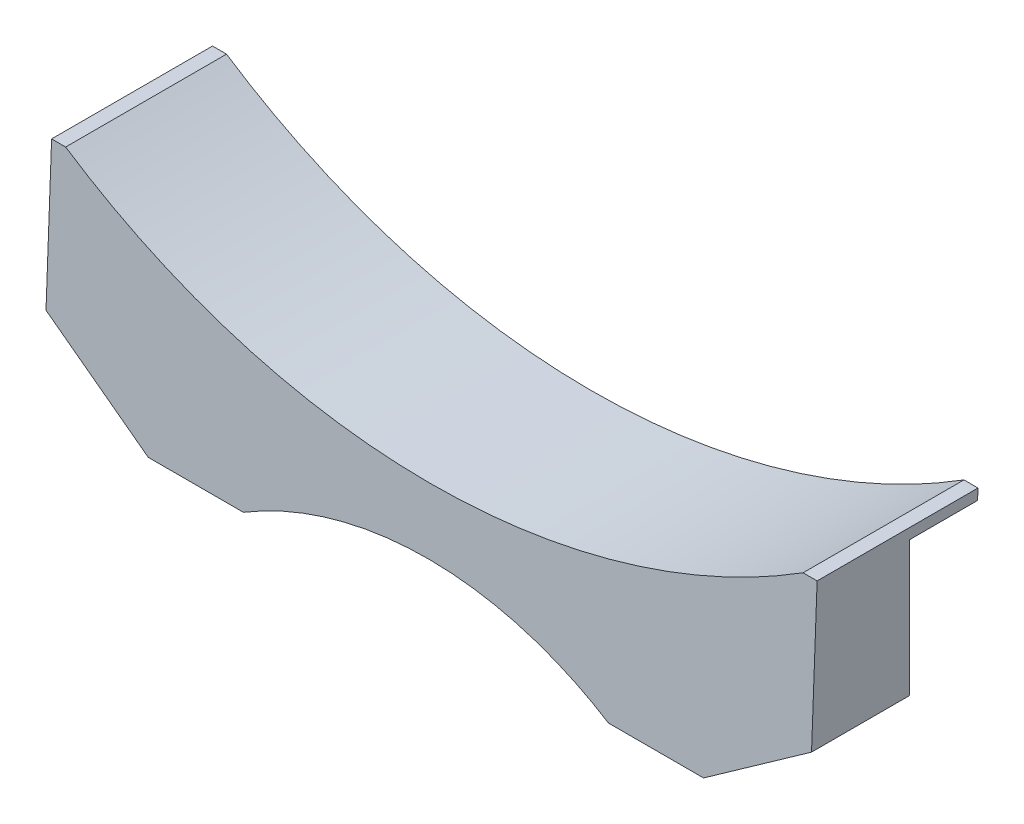
ISO-10303-21;
HEADER;
FILE_DESCRIPTION(('STEP AP214'),'2;1');
FILE_NAME('part.step','',(''),(''),'','','');
FILE_SCHEMA(('AUTOMOTIVE_DESIGN { 1 0 10303 214 1 1 1 1 }'));
ENDSEC;
DATA;
#1=APPLICATION_CONTEXT('core data for automotive mechanical design processes');
#2=APPLICATION_PROTOCOL_DEFINITION('international standard','automotive_design',2000,#1);
#3=PRODUCT_CONTEXT('',#1,'mechanical');
#4=PRODUCT('Part','Part','',(#3));
#5=PRODUCT_RELATED_PRODUCT_CATEGORY('part','',(#4));
#6=PRODUCT_DEFINITION_FORMATION('','',#4);
#7=PRODUCT_DEFINITION_CONTEXT('part definition',#1,'design');
#8=PRODUCT_DEFINITION('design','',#6,#7);
#9=PRODUCT_DEFINITION_SHAPE('','',#8);
#10=(LENGTH_UNIT() NAMED_UNIT(*) SI_UNIT(.MILLI.,.METRE.));
#11=(NAMED_UNIT(*) PLANE_ANGLE_UNIT() SI_UNIT($,.RADIAN.));
#12=(NAMED_UNIT(*) SI_UNIT($,.STERADIAN.) SOLID_ANGLE_UNIT());
#13=UNCERTAINTY_MEASURE_WITH_UNIT(LENGTH_MEASURE(1.E-05),#10,'distance_accuracy_value','');
#14=(GEOMETRIC_REPRESENTATION_CONTEXT(3) GLOBAL_UNCERTAINTY_ASSIGNED_CONTEXT((#13)) GLOBAL_UNIT_ASSIGNED_CONTEXT((#10,
#11,#12)) REPRESENTATION_CONTEXT('',''));
#15=CARTESIAN_POINT('',(0.,0.,0.));
#16=DIRECTION('',(0.,0.,1.));
#17=DIRECTION('',(1.,0.,0.));
#18=AXIS2_PLACEMENT_3D('',#15,#16,#17);
#19=CARTESIAN_POINT('',(12.3672169018671,-10.9582396338025,6.58));
#20=DIRECTION('',(0.,0.,-1.));
#21=DIRECTION('',(0.,1.,0.));
#22=AXIS2_PLACEMENT_3D('',#19,#20,#21);
#23=PLANE('',#22);
#24=DIRECTION('',(-0.819550109352107,-0.573007520248164,0.));
#25=VECTOR('',#24,1.);
#26=CARTESIAN_POINT('',(6.074318290855,-17.7929098966027,6.58));
#27=LINE('',#26,#25);
#28=CARTESIAN_POINT('',(8.37499999999795,-16.1843347698438,6.58));
#29=VERTEX_POINT('',#28);
#30=CARTESIAN_POINT('',(6.074318290855,-17.7929098966027,6.58));
#31=VERTEX_POINT('',#30);
#32=EDGE_CURVE('E85',#29,#31,#27,.T.);
#33=ORIENTED_EDGE('',*,*,#32,.T.);
#34=DIRECTION('',(1.,0.,0.));
#35=VECTOR('',#34,1.);
#36=CARTESIAN_POINT('',(3.993745109543,-17.7929098966027,6.58));
#37=LINE('',#36,#35);
#38=CARTESIAN_POINT('',(3.9935960408029,-17.7929098966027,6.58));
#39=VERTEX_POINT('',#38);
#40=EDGE_CURVE('E163',#31,#39,#37,.F.);
#41=ORIENTED_EDGE('',*,*,#40,.T.);
#42=CARTESIAN_POINT('',(0.,-24.5028211392062,6.58));
#43=DIRECTION('',(0.,0.,1.));
#44=DIRECTION('',(0.,-1.,0.));
#45=AXIS2_PLACEMENT_3D('',#42,#43,#44);
#46=CIRCLE('',#45,7.80843891061033);
#47=CARTESIAN_POINT('',(1.88722564128328,-16.9258760028325,6.58));
#48=VERTEX_POINT('',#47);
#49=EDGE_CURVE('E106',#39,#48,#46,.T.);
#50=ORIENTED_EDGE('',*,*,#49,.T.);
#51=DIRECTION('',(-0.868989755925164,-0.494830075982779,0.));
#52=VECTOR('',#51,1.);
#53=CARTESIAN_POINT('',(-1.90913270574887,-19.0876417503698,6.58));
#54=LINE('',#53,#52);
#55=CARTESIAN_POINT('',(8.37499999999985,-13.2315333975334,6.58));
#56=VERTEX_POINT('',#55);
#57=EDGE_CURVE('E102',#48,#56,#54,.F.);
#58=ORIENTED_EDGE('',*,*,#57,.T.);
#59=DIRECTION('',(-6.46237264413794E-13,-1.,0.));
#60=VECTOR('',#59,1.);
#61=CARTESIAN_POINT('',(8.37499999999794,-16.1843347698438,6.58));
#62=LINE('',#61,#60);
#63=EDGE_CURVE('E104',#56,#29,#62,.T.);
#64=ORIENTED_EDGE('',*,*,#63,.T.);
#65=EDGE_LOOP('',(#33,#41,#50,#58,#64));
#66=FACE_BOUND('',#65,.T.);
#67=ADVANCED_FACE('F16',(#66),#23,.T.);
#68=CARTESIAN_POINT('',(-12.1258749192069,-11.0956673431733,6.58));
#69=DIRECTION('',(0.,0.,1.));
#70=DIRECTION('',(0.,-1.,0.));
#71=AXIS2_PLACEMENT_3D('',#68,#69,#70);
#72=PLANE('',#71);
#73=CARTESIAN_POINT('',(0.,-24.5028211392062,6.58));
#74=DIRECTION('',(0.,0.,1.));
#75=DIRECTION('',(0.,-1.,0.));
#76=AXIS2_PLACEMENT_3D('',#73,#74,#75);
#77=CIRCLE('',#76,7.80843891061033);
#78=CARTESIAN_POINT('',(-1.88722564128269,-16.9258760028324,6.58));
#79=VERTEX_POINT('',#78);
#80=CARTESIAN_POINT('',(-3.9935960408029,-17.7929098966027,6.58));
#81=VERTEX_POINT('',#80);
#82=EDGE_CURVE('E19',#79,#81,#77,.T.);
#83=ORIENTED_EDGE('',*,*,#82,.T.);
#84=DIRECTION('',(1.,0.,0.));
#85=VECTOR('',#84,1.);
#86=CARTESIAN_POINT('',(-12.1258749192069,-17.7929098966027,6.58));
#87=LINE('',#86,#85);
#88=CARTESIAN_POINT('',(-6.07568170914495,-17.7929098966027,6.58));
#89=VERTEX_POINT('',#88);
#90=EDGE_CURVE('E190',#81,#89,#87,.F.);
#91=ORIENTED_EDGE('',*,*,#90,.T.);
#92=DIRECTION('',(-0.819550109352106,0.573007520248165,0.));
#93=VECTOR('',#92,1.);
#94=CARTESIAN_POINT('',(-8.375,-16.1852880354505,6.58));
#95=LINE('',#94,#93);
#96=CARTESIAN_POINT('',(-8.375,-16.1852880354505,6.58));
#97=VERTEX_POINT('',#96);
#98=EDGE_CURVE('E155',#89,#97,#95,.T.);
#99=ORIENTED_EDGE('',*,*,#98,.T.);
#100=DIRECTION('',(0.,1.,0.));
#101=VECTOR('',#100,1.);
#102=CARTESIAN_POINT('',(-8.375,-13.,6.58));
#103=LINE('',#102,#101);
#104=CARTESIAN_POINT('',(-8.375,-13.2315333975374,6.58));
#105=VERTEX_POINT('',#104);
#106=EDGE_CURVE('E143',#97,#105,#103,.T.);
#107=ORIENTED_EDGE('',*,*,#106,.T.);
#108=DIRECTION('',(0.868989755925428,-0.494830075982317,0.));
#109=VECTOR('',#108,1.);
#110=CARTESIAN_POINT('',(2.65904385816105,-19.5146647273325,6.58));
#111=LINE('',#110,#109);
#112=EDGE_CURVE('E111',#79,#105,#111,.F.);
#113=ORIENTED_EDGE('',*,*,#112,.F.);
#114=EDGE_LOOP('',(#83,#91,#99,#107,#113));
#115=FACE_BOUND('',#114,.T.);
#116=ADVANCED_FACE('F203',(#115),#72,.F.);
#117=CARTESIAN_POINT('',(2.65904385816105,-19.5146647273325,6.58));
#118=DIRECTION('',(-0.494830075982317,-0.868989755925428,0.));
#119=DIRECTION('',(0.868989755925428,-0.494830075982317,0.));
#120=AXIS2_PLACEMENT_3D('',#117,#118,#119);
#121=PLANE('',#120);
#122=DIRECTION('',(0.,0.,1.));
#123=VECTOR('',#122,1.);
#124=CARTESIAN_POINT('',(-1.8872256412827,-16.9258760028324,8.78434268833087));
#125=LINE('',#124,#123);
#126=CARTESIAN_POINT('',(-1.8872256412827,-16.9258760028324,5.23099523087817));
#127=VERTEX_POINT('',#126);
#128=EDGE_CURVE('E194',#127,#79,#125,.T.);
#129=ORIENTED_EDGE('',*,*,#128,.T.);
#130=ORIENTED_EDGE('',*,*,#112,.T.);
#131=DIRECTION('',(0.,0.,1.));
#132=VECTOR('',#131,1.);
#133=CARTESIAN_POINT('',(-8.375,-13.2315333975374,8.6));
#134=LINE('',#133,#132);
#135=CARTESIAN_POINT('',(-8.375,-13.2315333975374,5.08890513067451));
#136=VERTEX_POINT('',#135);
#137=EDGE_CURVE('E139',#105,#136,#134,.F.);
#138=ORIENTED_EDGE('',*,*,#137,.T.);
#139=DIRECTION('',(-0.868832418448767,0.494740483078604,-0.0190284801184085));
#140=VECTOR('',#139,1.);
#141=CARTESIAN_POINT('',(-1.8872256412827,-16.9258760028324,5.23099523087817));
#142=LINE('',#141,#140);
#143=EDGE_CURVE('E136',#127,#136,#142,.T.);
#144=ORIENTED_EDGE('',*,*,#143,.F.);
#145=EDGE_LOOP('',(#129,#130,#138,#144));
#146=FACE_BOUND('',#145,.T.);
#147=ADVANCED_FACE('F326',(#146),#121,.T.);
#148=CARTESIAN_POINT('',(-1.90913270574887,-19.0876417503698,6.58));
#149=DIRECTION('',(-0.494830075982779,0.868989755925164,0.));
#150=DIRECTION('',(-0.868989755925164,-0.494830075982779,0.));
#151=AXIS2_PLACEMENT_3D('',#148,#149,#150);
#152=PLANE('',#151);
#153=DIRECTION('',(0.,0.,1.));
#154=VECTOR('',#153,1.);
#155=CARTESIAN_POINT('',(8.37499999999985,-13.2315333975334,8.72247441422476));
#156=LINE('',#155,#154);
#157=CARTESIAN_POINT('',(8.37499999999995,-13.2315333975333,5.08890513067436));
#158=VERTEX_POINT('',#157);
#159=EDGE_CURVE('E110',#158,#56,#156,.T.);
#160=ORIENTED_EDGE('',*,*,#159,.T.);
#161=ORIENTED_EDGE('',*,*,#57,.F.);
#162=DIRECTION('',(0.,0.,1.));
#163=VECTOR('',#162,1.);
#164=CARTESIAN_POINT('',(1.88722564128328,-16.9258760028325,6.58));
#165=LINE('',#164,#163);
#166=CARTESIAN_POINT('',(1.88722564128334,-16.9258760028326,5.23099523087818));
#167=VERTEX_POINT('',#166);
#168=EDGE_CURVE('E195',#48,#167,#165,.F.);
#169=ORIENTED_EDGE('',*,*,#168,.T.);
#170=DIRECTION('',(-0.868832418448499,-0.494740483079074,0.0190284801184265));
#171=VECTOR('',#170,1.);
#172=CARTESIAN_POINT('',(8.37499999999985,-13.2315333975334,5.08890513067436));
#173=LINE('',#172,#171);
#174=EDGE_CURVE('E124',#158,#167,#173,.T.);
#175=ORIENTED_EDGE('',*,*,#174,.F.);
#176=EDGE_LOOP('',(#160,#161,#169,#175));
#177=FACE_BOUND('',#176,.T.);
#178=ADVANCED_FACE('F122',(#177),#152,.F.);
#179=CARTESIAN_POINT('',(8.37499999999794,-16.1843347698438,8.72247441422476));
#180=DIRECTION('',(-1.,6.46237264413794E-13,0.));
#181=DIRECTION('',(-6.46237264413794E-13,-1.,0.));
#182=AXIS2_PLACEMENT_3D('',#179,#180,#181);
#183=PLANE('',#182);
#184=ORIENTED_EDGE('',*,*,#159,.F.);
#185=DIRECTION('',(0.,0.999261174631314,-0.0384331221012056));
#186=VECTOR('',#185,1.);
#187=CARTESIAN_POINT('',(8.375,-24.4929098966027,5.52203499602319));
#188=LINE('',#187,#186);
#189=CARTESIAN_POINT('',(8.375,-13.,5.08));
#190=VERTEX_POINT('',#189);
#191=EDGE_CURVE('E244',#190,#158,#188,.F.);
#192=ORIENTED_EDGE('',*,*,#191,.F.);
#193=DIRECTION('',(0.,0.,-1.));
#194=VECTOR('',#193,1.);
#195=CARTESIAN_POINT('',(8.375,-13.,8.6));
#196=LINE('',#195,#194);
#197=CARTESIAN_POINT('',(8.375,-13.,8.6));
#198=VERTEX_POINT('',#197);
#199=EDGE_CURVE('E235',#190,#198,#196,.F.);
#200=ORIENTED_EDGE('',*,*,#199,.T.);
#201=DIRECTION('',(0.,0.999261174631314,-0.0384331221012049));
#202=VECTOR('',#201,1.);
#203=CARTESIAN_POINT('',(8.375,0.,8.09999999999999));
#204=LINE('',#203,#202);
#205=CARTESIAN_POINT('',(8.37499999999932,-16.1843347698429,8.7224744142247));
#206=VERTEX_POINT('',#205);
#207=EDGE_CURVE('E226',#198,#206,#204,.F.);
#208=ORIENTED_EDGE('',*,*,#207,.T.);
#209=DIRECTION('',(0.,0.,1.));
#210=VECTOR('',#209,1.);
#211=CARTESIAN_POINT('',(8.37499999999796,-16.1843347698438,8.78434268833087));
#212=LINE('',#211,#210);
#213=EDGE_CURVE('E119',#206,#29,#212,.F.);
#214=ORIENTED_EDGE('',*,*,#213,.T.);
#215=ORIENTED_EDGE('',*,*,#63,.F.);
#216=EDGE_LOOP('',(#184,#192,#200,#208,#214,#215));
#217=FACE_BOUND('',#216,.T.);
#218=ADVANCED_FACE('F115',(#217),#183,.F.);
#219=CARTESIAN_POINT('',(6.074318290855,-17.7929098966027,8.78434268833087));
#220=DIRECTION('',(-0.573007520248164,0.819550109352107,0.));
#221=DIRECTION('',(-0.819550109352107,-0.573007520248164,0.));
#222=AXIS2_PLACEMENT_3D('',#219,#220,#221);
#223=PLANE('',#222);
#224=ORIENTED_EDGE('',*,*,#213,.F.);
#225=DIRECTION('',(-0.819351151403249,-0.572868414170822,0.0220334005450319));
#226=VECTOR('',#225,1.);
#227=CARTESIAN_POINT('',(8.37499999999794,-16.1843347698438,8.72247441422476));
#228=LINE('',#227,#226);
#229=CARTESIAN_POINT('',(6.074318290855,-17.7929098966027,8.78434268833087));
#230=VERTEX_POINT('',#229);
#231=EDGE_CURVE('E224',#206,#230,#228,.T.);
#232=ORIENTED_EDGE('',*,*,#231,.T.);
#233=DIRECTION('',(0.,0.,1.));
#234=VECTOR('',#233,1.);
#235=CARTESIAN_POINT('',(6.074318290855,-17.7929098966027,8.78434268833087));
#236=LINE('',#235,#234);
#237=EDGE_CURVE('E165',#230,#31,#236,.F.);
#238=ORIENTED_EDGE('',*,*,#237,.T.);
#239=ORIENTED_EDGE('',*,*,#32,.F.);
#240=EDGE_LOOP('',(#224,#232,#238,#239));
#241=FACE_BOUND('',#240,.T.);
#242=ADVANCED_FACE('F358',(#241),#223,.F.);
#243=CARTESIAN_POINT('',(3.993745109543,-17.7929098966027,8.78434268833087));
#244=DIRECTION('',(0.,1.,0.));
#245=DIRECTION('',(0.,0.,1.));
#246=AXIS2_PLACEMENT_3D('',#243,#244,#245);
#247=PLANE('',#246);
#248=ORIENTED_EDGE('',*,*,#237,.F.);
#249=DIRECTION('',(1.,0.,0.));
#250=VECTOR('',#249,1.);
#251=CARTESIAN_POINT('',(0.,-17.7929098966027,8.78434268833087));
#252=LINE('',#251,#250);
#253=CARTESIAN_POINT('',(3.9935960408029,-17.7929098966027,8.78434268833087));
#254=VERTEX_POINT('',#253);
#255=EDGE_CURVE('E186',#230,#254,#252,.F.);
#256=ORIENTED_EDGE('',*,*,#255,.T.);
#257=DIRECTION('',(0.,0.,1.));
#258=VECTOR('',#257,1.);
#259=CARTESIAN_POINT('',(3.9935960408029,-17.7929098966027,8.78434268833087));
#260=LINE('',#259,#258);
#261=EDGE_CURVE('E197',#254,#39,#260,.F.);
#262=ORIENTED_EDGE('',*,*,#261,.T.);
#263=ORIENTED_EDGE('',*,*,#40,.F.);
#264=EDGE_LOOP('',(#248,#256,#262,#263));
#265=FACE_BOUND('',#264,.T.);
#266=ADVANCED_FACE('F222',(#265),#247,.F.);
#267=CARTESIAN_POINT('',(0.,-24.5028211392062,8.78434268833087));
#268=DIRECTION('',(0.,0.,1.));
#269=DIRECTION('',(0.,-1.,0.));
#270=AXIS2_PLACEMENT_3D('',#267,#268,#269);
#271=CYLINDRICAL_SURFACE('',#270,7.80843891061033);
#272=CARTESIAN_POINT('',(0.,-24.5028211392062,5.52241619766179));
#273=DIRECTION('',(0.,-0.0384331221012056,-0.999261174631314));
#274=DIRECTION('',(0.,-0.999261174631314,0.0384331221012056));
#275=AXIS2_PLACEMENT_3D('',#272,#273,#274);
#276=ELLIPSE('',#275,7.81421224885608,7.80843891061033);
#277=EDGE_CURVE('E187',#167,#127,#276,.F.);
#278=ORIENTED_EDGE('',*,*,#277,.F.);
#279=ORIENTED_EDGE('',*,*,#168,.F.);
#280=ORIENTED_EDGE('',*,*,#49,.F.);
#281=ORIENTED_EDGE('',*,*,#261,.F.);
#282=CARTESIAN_POINT('',(0.,-24.5028211392062,9.04241619766178));
#283=DIRECTION('',(0.,-0.0384331221012049,-0.999261174631314));
#284=DIRECTION('',(0.,-0.999261174631314,0.0384331221012049));
#285=AXIS2_PLACEMENT_3D('',#282,#283,#284);
#286=ELLIPSE('',#285,7.81421224885608,7.80843891061033);
#287=CARTESIAN_POINT('',(-3.9935960408029,-17.7929098966027,8.78434268833087));
#288=VERTEX_POINT('',#287);
#289=EDGE_CURVE('E182',#254,#288,#286,.F.);
#290=ORIENTED_EDGE('',*,*,#289,.T.);
#291=DIRECTION('',(0.,0.,1.));
#292=VECTOR('',#291,1.);
#293=CARTESIAN_POINT('',(-3.9935960408029,-17.7929098966027,8.78434268833087));
#294=LINE('',#293,#292);
#295=EDGE_CURVE('E192',#288,#81,#294,.F.);
#296=ORIENTED_EDGE('',*,*,#295,.T.);
#297=ORIENTED_EDGE('',*,*,#82,.F.);
#298=ORIENTED_EDGE('',*,*,#128,.F.);
#299=EDGE_LOOP('',(#278,#279,#280,#281,#290,#296,#297,#298));
#300=FACE_BOUND('',#299,.T.);
#301=ADVANCED_FACE('F213',(#300),#271,.F.);
#302=CARTESIAN_POINT('',(-6.075681709145,-17.7929098966027,8.78434268833087));
#303=DIRECTION('',(0.,1.,0.));
#304=DIRECTION('',(0.,0.,1.));
#305=AXIS2_PLACEMENT_3D('',#302,#303,#304);
#306=PLANE('',#305);
#307=ORIENTED_EDGE('',*,*,#90,.F.);
#308=ORIENTED_EDGE('',*,*,#295,.F.);
#309=DIRECTION('',(1.,0.,0.));
#310=VECTOR('',#309,1.);
#311=CARTESIAN_POINT('',(0.,-17.7929098966027,8.78434268833087));
#312=LINE('',#311,#310);
#313=CARTESIAN_POINT('',(-6.07568170914499,-17.7929098966027,8.78434268833087));
#314=VERTEX_POINT('',#313);
#315=EDGE_CURVE('E185',#288,#314,#312,.F.);
#316=ORIENTED_EDGE('',*,*,#315,.T.);
#317=DIRECTION('',(0.,0.,1.));
#318=VECTOR('',#317,1.);
#319=CARTESIAN_POINT('',(-6.07568170914497,-17.7929098966027,8.72251107828656));
#320=LINE('',#319,#318);
#321=EDGE_CURVE('E158',#314,#89,#320,.F.);
#322=ORIENTED_EDGE('',*,*,#321,.T.);
#323=EDGE_LOOP('',(#307,#308,#316,#322));
#324=FACE_BOUND('',#323,.T.);
#325=ADVANCED_FACE('F208',(#324),#306,.F.);
#326=CARTESIAN_POINT('',(-8.375,-16.1852880354505,8.72251107828656));
#327=DIRECTION('',(0.573007520248165,0.819550109352106,0.));
#328=DIRECTION('',(-0.819550109352106,0.573007520248165,0.));
#329=AXIS2_PLACEMENT_3D('',#326,#327,#328);
#330=PLANE('',#329);
#331=ORIENTED_EDGE('',*,*,#98,.F.);
#332=ORIENTED_EDGE('',*,*,#321,.F.);
#333=DIRECTION('',(-0.819351151403245,0.572868414170827,-0.0220334005450319));
#334=VECTOR('',#333,1.);
#335=CARTESIAN_POINT('',(-6.075681709145,-17.7929098966027,8.78434268833087));
#336=LINE('',#335,#334);
#337=CARTESIAN_POINT('',(-8.375,-16.1852880354505,8.72251107828656));
#338=VERTEX_POINT('',#337);
#339=EDGE_CURVE('E261',#314,#338,#336,.T.);
#340=ORIENTED_EDGE('',*,*,#339,.T.);
#341=DIRECTION('',(0.,0.,1.));
#342=VECTOR('',#341,1.);
#343=CARTESIAN_POINT('',(-8.375,-16.1852880354505,8.6));
#344=LINE('',#343,#342);
#345=EDGE_CURVE('E152',#338,#97,#344,.F.);
#346=ORIENTED_EDGE('',*,*,#345,.T.);
#347=EDGE_LOOP('',(#331,#332,#340,#346));
#348=FACE_BOUND('',#347,.T.);
#349=ADVANCED_FACE('F307',(#348),#330,.F.);
#350=CARTESIAN_POINT('',(-8.375,-13.,8.6));
#351=DIRECTION('',(1.,0.,0.));
#352=DIRECTION('',(0.,1.,0.));
#353=AXIS2_PLACEMENT_3D('',#350,#351,#352);
#354=PLANE('',#353);
#355=ORIENTED_EDGE('',*,*,#106,.F.);
#356=ORIENTED_EDGE('',*,*,#345,.F.);
#357=DIRECTION('',(0.,0.999261174631314,-0.0384331221012049));
#358=VECTOR('',#357,1.);
#359=CARTESIAN_POINT('',(-8.375,0.,8.09999999999999));
#360=LINE('',#359,#358);
#361=CARTESIAN_POINT('',(-8.375,-13.,8.6));
#362=VERTEX_POINT('',#361);
#363=EDGE_CURVE('E258',#338,#362,#360,.T.);
#364=ORIENTED_EDGE('',*,*,#363,.T.);
#365=DIRECTION('',(0.,0.,-1.));
#366=VECTOR('',#365,1.);
#367=CARTESIAN_POINT('',(-8.375,-13.,8.6));
#368=LINE('',#367,#366);
#369=CARTESIAN_POINT('',(-8.375,-13.,5.08));
#370=VERTEX_POINT('',#369);
#371=EDGE_CURVE('E142',#362,#370,#368,.T.);
#372=ORIENTED_EDGE('',*,*,#371,.T.);
#373=DIRECTION('',(0.,0.999261174631314,-0.0384331221012056));
#374=VECTOR('',#373,1.);
#375=CARTESIAN_POINT('',(-8.375,-24.4929098966027,5.52203499602319));
#376=LINE('',#375,#374);
#377=EDGE_CURVE('E132',#136,#370,#376,.T.);
#378=ORIENTED_EDGE('',*,*,#377,.F.);
#379=ORIENTED_EDGE('',*,*,#137,.F.);
#380=EDGE_LOOP('',(#355,#356,#364,#372,#378,#379));
#381=FACE_BOUND('',#380,.T.);
#382=ADVANCED_FACE('F324',(#381),#354,.F.);
#383=CARTESIAN_POINT('',(-8.067837380612,-13.,8.6));
#384=DIRECTION('',(0.,-1.,0.));
#385=DIRECTION('',(0.,0.,-1.));
#386=AXIS2_PLACEMENT_3D('',#383,#384,#385);
#387=PLANE('',#386);
#388=DIRECTION('',(0.,0.,1.));
#389=VECTOR('',#388,1.);
#390=CARTESIAN_POINT('',(-8.0676761602688,-13.,8.6));
#391=LINE('',#390,#389);
#392=CARTESIAN_POINT('',(-8.0676761602688,-13.,8.6));
#393=VERTEX_POINT('',#392);
#394=CARTESIAN_POINT('',(-8.0676761602688,-13.,5.08));
#395=VERTEX_POINT('',#394);
#396=EDGE_CURVE('E178',#393,#395,#391,.F.);
#397=ORIENTED_EDGE('',*,*,#396,.T.);
#398=DIRECTION('',(1.,0.,0.));
#399=VECTOR('',#398,1.);
#400=CARTESIAN_POINT('',(0.,-13.,5.08));
#401=LINE('',#400,#399);
#402=EDGE_CURVE('E135',#370,#395,#401,.T.);
#403=ORIENTED_EDGE('',*,*,#402,.F.);
#404=ORIENTED_EDGE('',*,*,#371,.F.);
#405=DIRECTION('',(1.,0.,0.));
#406=VECTOR('',#405,1.);
#407=CARTESIAN_POINT('',(0.,-13.,8.6));
#408=LINE('',#407,#406);
#409=EDGE_CURVE('E181',#362,#393,#408,.T.);
#410=ORIENTED_EDGE('',*,*,#409,.T.);
#411=EDGE_LOOP('',(#397,#403,#404,#410));
#412=FACE_BOUND('',#411,.T.);
#413=ADVANCED_FACE('F314',(#412),#387,.F.);
#414=CARTESIAN_POINT('',(0.,-24.4929098966027,5.52203499602319));
#415=DIRECTION('',(0.,-0.0384331221012056,-0.999261174631314));
#416=DIRECTION('',(0.,0.999261174631314,-0.0384331221012056));
#417=AXIS2_PLACEMENT_3D('',#414,#415,#416);
#418=PLANE('',#417);
#419=ORIENTED_EDGE('',*,*,#191,.T.);
#420=ORIENTED_EDGE('',*,*,#174,.T.);
#421=ORIENTED_EDGE('',*,*,#277,.T.);
#422=ORIENTED_EDGE('',*,*,#143,.T.);
#423=ORIENTED_EDGE('',*,*,#377,.T.);
#424=ORIENTED_EDGE('',*,*,#402,.T.);
#425=CARTESIAN_POINT('',(0.,0.0192307692307615,4.57926035502957));
#426=DIRECTION('',(0.,-0.0384331221012056,-0.999261174631314));
#427=DIRECTION('',(0.,-0.999261174631314,0.0384331221012056));
#428=AXIS2_PLACEMENT_3D('',#425,#426,#427);
#429=ELLIPSE('',#428,15.3275827114246,15.3162583044768);
#430=CARTESIAN_POINT('',(8.0676761602688,-13.,5.08));
#431=VERTEX_POINT('',#430);
#432=EDGE_CURVE('E175',#395,#431,#429,.F.);
#433=ORIENTED_EDGE('',*,*,#432,.T.);
#434=DIRECTION('',(1.,0.,0.));
#435=VECTOR('',#434,1.);
#436=CARTESIAN_POINT('',(8.375,-13.,5.08));
#437=LINE('',#436,#435);
#438=EDGE_CURVE('E238',#431,#190,#437,.T.);
#439=ORIENTED_EDGE('',*,*,#438,.T.);
#440=EDGE_LOOP('',(#419,#420,#421,#422,#423,#424,#433,#439));
#441=FACE_BOUND('',#440,.T.);
#442=ADVANCED_FACE('F291',(#441),#418,.T.);
#443=CARTESIAN_POINT('',(8.375,-13.,8.6));
#444=DIRECTION('',(0.,-1.,0.));
#445=DIRECTION('',(0.,0.,-1.));
#446=AXIS2_PLACEMENT_3D('',#443,#444,#445);
#447=PLANE('',#446);
#448=ORIENTED_EDGE('',*,*,#199,.F.);
#449=ORIENTED_EDGE('',*,*,#438,.F.);
#450=DIRECTION('',(0.,0.,1.));
#451=VECTOR('',#450,1.);
#452=CARTESIAN_POINT('',(8.0676761602688,-13.,5.08));
#453=LINE('',#452,#451);
#454=CARTESIAN_POINT('',(8.0676761602688,-13.,8.6));
#455=VERTEX_POINT('',#454);
#456=EDGE_CURVE('E25',#431,#455,#453,.T.);
#457=ORIENTED_EDGE('',*,*,#456,.T.);
#458=DIRECTION('',(1.,0.,0.));
#459=VECTOR('',#458,1.);
#460=CARTESIAN_POINT('',(0.,-13.,8.6));
#461=LINE('',#460,#459);
#462=EDGE_CURVE('E33',#455,#198,#461,.T.);
#463=ORIENTED_EDGE('',*,*,#462,.T.);
#464=EDGE_LOOP('',(#448,#449,#457,#463));
#465=FACE_BOUND('',#464,.T.);
#466=ADVANCED_FACE('F295',(#465),#447,.F.);
#467=CARTESIAN_POINT('',(0.,0.,8.09999999999999));
#468=DIRECTION('',(0.,-0.0384331221012049,-0.999261174631314));
#469=DIRECTION('',(0.,0.999261174631314,-0.0384331221012049));
#470=AXIS2_PLACEMENT_3D('',#467,#468,#469);
#471=PLANE('',#470);
#472=ORIENTED_EDGE('',*,*,#363,.F.);
#473=ORIENTED_EDGE('',*,*,#339,.F.);
#474=ORIENTED_EDGE('',*,*,#315,.F.);
#475=ORIENTED_EDGE('',*,*,#289,.F.);
#476=ORIENTED_EDGE('',*,*,#255,.F.);
#477=ORIENTED_EDGE('',*,*,#231,.F.);
#478=ORIENTED_EDGE('',*,*,#207,.F.);
#479=ORIENTED_EDGE('',*,*,#462,.F.);
#480=CARTESIAN_POINT('',(0.,0.019230769230762,8.09926035502958));
#481=DIRECTION('',(0.,-0.0384331221012049,-0.999261174631314));
#482=DIRECTION('',(0.,-0.999261174631314,0.0384331221012049));
#483=AXIS2_PLACEMENT_3D('',#480,#481,#482);
#484=ELLIPSE('',#483,15.3275827114246,15.3162583044768);
#485=EDGE_CURVE('E11',#455,#393,#484,.T.);
#486=ORIENTED_EDGE('',*,*,#485,.T.);
#487=ORIENTED_EDGE('',*,*,#409,.F.);
#488=EDGE_LOOP('',(#472,#473,#474,#475,#476,#477,#478,#479,#486,#487));
#489=FACE_BOUND('',#488,.T.);
#490=ADVANCED_FACE('F217',(#489),#471,.F.);
#491=CARTESIAN_POINT('',(0.,0.0192307692307621,8.6));
#492=DIRECTION('',(0.,0.,1.));
#493=DIRECTION('',(0.,-1.,0.));
#494=AXIS2_PLACEMENT_3D('',#491,#492,#493);
#495=CYLINDRICAL_SURFACE('',#494,15.3162583044768);
#496=ORIENTED_EDGE('',*,*,#456,.F.);
#497=ORIENTED_EDGE('',*,*,#432,.F.);
#498=ORIENTED_EDGE('',*,*,#396,.F.);
#499=ORIENTED_EDGE('',*,*,#485,.F.);
#500=EDGE_LOOP('',(#496,#497,#498,#499));
#501=FACE_BOUND('',#500,.T.);
#502=ADVANCED_FACE('F317',(#501),#495,.F.);
#503=CLOSED_SHELL('',(#67,#116,#147,#178,#218,#242,#266,#301,#325,#349,#382,#413,#442,#466,#490,#502));
#504=MANIFOLD_SOLID_BREP('B1',#503);
#505=ADVANCED_BREP_SHAPE_REPRESENTATION('',(#18,#504),#14);
#506=SHAPE_DEFINITION_REPRESENTATION(#9,#505);
ENDSEC;
END-ISO-10303-21;
